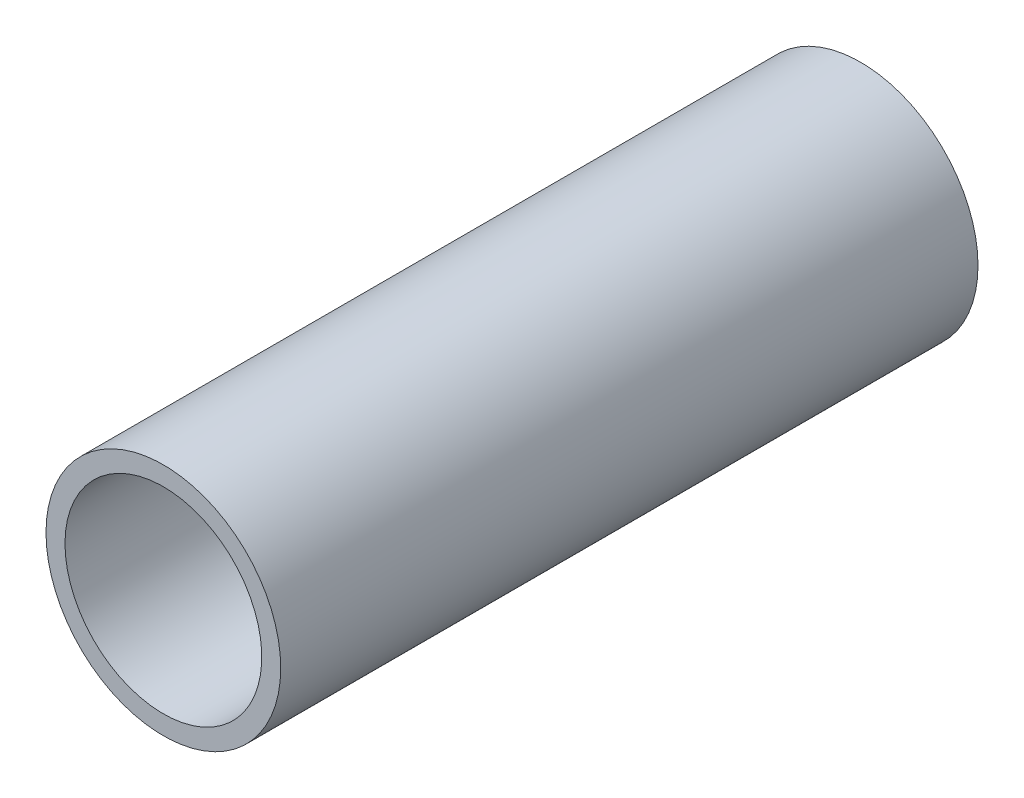
ISO-10303-21;
HEADER;
FILE_DESCRIPTION(('STEP AP214'),'2;1');
FILE_NAME('part.step','',(''),(''),'','','');
FILE_SCHEMA(('AUTOMOTIVE_DESIGN { 1 0 10303 214 1 1 1 1 }'));
ENDSEC;
DATA;
#1=APPLICATION_CONTEXT('core data for automotive mechanical design processes');
#2=APPLICATION_PROTOCOL_DEFINITION('international standard','automotive_design',2000,#1);
#3=PRODUCT_CONTEXT('',#1,'mechanical');
#4=PRODUCT('Part','Part','',(#3));
#5=PRODUCT_RELATED_PRODUCT_CATEGORY('part','',(#4));
#6=PRODUCT_DEFINITION_FORMATION('','',#4);
#7=PRODUCT_DEFINITION_CONTEXT('part definition',#1,'design');
#8=PRODUCT_DEFINITION('design','',#6,#7);
#9=PRODUCT_DEFINITION_SHAPE('','',#8);
#10=(LENGTH_UNIT() NAMED_UNIT(*) SI_UNIT(.MILLI.,.METRE.));
#11=(NAMED_UNIT(*) PLANE_ANGLE_UNIT() SI_UNIT($,.RADIAN.));
#12=(NAMED_UNIT(*) SI_UNIT($,.STERADIAN.) SOLID_ANGLE_UNIT());
#13=UNCERTAINTY_MEASURE_WITH_UNIT(LENGTH_MEASURE(1.E-05),#10,'distance_accuracy_value','');
#14=(GEOMETRIC_REPRESENTATION_CONTEXT(3) GLOBAL_UNCERTAINTY_ASSIGNED_CONTEXT((#13)) GLOBAL_UNIT_ASSIGNED_CONTEXT((#10,
#11,#12)) REPRESENTATION_CONTEXT('',''));
#15=CARTESIAN_POINT('',(0.,0.,0.));
#16=DIRECTION('',(0.,0.,1.));
#17=DIRECTION('',(1.,0.,0.));
#18=AXIS2_PLACEMENT_3D('',#15,#16,#17);
#19=CARTESIAN_POINT('',(0.,0.,180.));
#20=DIRECTION('',(0.,0.,1.));
#21=DIRECTION('',(1.,0.,0.));
#22=AXIS2_PLACEMENT_3D('',#19,#20,#21);
#23=PLANE('',#22);
#24=CARTESIAN_POINT('',(0.,0.,180.));
#25=DIRECTION('',(0.,0.,1.));
#26=DIRECTION('',(1.,0.,0.));
#27=AXIS2_PLACEMENT_3D('',#24,#25,#26);
#28=CIRCLE('',#27,30.3);
#29=CARTESIAN_POINT('',(-30.3,0.,180.));
#30=VERTEX_POINT('',#29);
#31=EDGE_CURVE('E10',#30,#30,#28,.T.);
#32=ORIENTED_EDGE('',*,*,#31,.T.);
#33=EDGE_LOOP('',(#32));
#34=FACE_BOUND('',#33,.T.);
#35=CARTESIAN_POINT('',(0.,0.,180.));
#36=DIRECTION('',(0.,0.,1.));
#37=DIRECTION('',(1.,0.,0.));
#38=AXIS2_PLACEMENT_3D('',#35,#36,#37);
#39=CIRCLE('',#38,25.4);
#40=CARTESIAN_POINT('',(-25.4,0.,180.));
#41=VERTEX_POINT('',#40);
#42=EDGE_CURVE('E54',#41,#41,#39,.T.);
#43=ORIENTED_EDGE('',*,*,#42,.F.);
#44=EDGE_LOOP('',(#43));
#45=FACE_BOUND('',#44,.T.);
#46=ADVANCED_FACE('F41',(#34,#45),#23,.T.);
#47=CARTESIAN_POINT('',(0.,0.,0.));
#48=DIRECTION('',(0.,0.,1.));
#49=DIRECTION('',(1.,0.,0.));
#50=AXIS2_PLACEMENT_3D('',#47,#48,#49);
#51=PLANE('',#50);
#52=CARTESIAN_POINT('',(0.,0.,0.));
#53=DIRECTION('',(0.,0.,1.));
#54=DIRECTION('',(1.,0.,0.));
#55=AXIS2_PLACEMENT_3D('',#52,#53,#54);
#56=CIRCLE('',#55,30.3);
#57=CARTESIAN_POINT('',(-30.3,0.,0.));
#58=VERTEX_POINT('',#57);
#59=EDGE_CURVE('E45',#58,#58,#56,.T.);
#60=ORIENTED_EDGE('',*,*,#59,.F.);
#61=EDGE_LOOP('',(#60));
#62=FACE_BOUND('',#61,.T.);
#63=CARTESIAN_POINT('',(0.,0.,0.));
#64=DIRECTION('',(0.,0.,1.));
#65=DIRECTION('',(1.,0.,0.));
#66=AXIS2_PLACEMENT_3D('',#63,#64,#65);
#67=CIRCLE('',#66,25.4);
#68=CARTESIAN_POINT('',(-25.4,0.,0.));
#69=VERTEX_POINT('',#68);
#70=EDGE_CURVE('E56',#69,#69,#67,.T.);
#71=ORIENTED_EDGE('',*,*,#70,.T.);
#72=EDGE_LOOP('',(#71));
#73=FACE_BOUND('',#72,.T.);
#74=ADVANCED_FACE('F68',(#62,#73),#51,.F.);
#75=CARTESIAN_POINT('',(0.,0.,180.));
#76=DIRECTION('',(0.,0.,-1.));
#77=DIRECTION('',(-1.,0.,0.));
#78=AXIS2_PLACEMENT_3D('',#75,#76,#77);
#79=CYLINDRICAL_SURFACE('',#78,30.3);
#80=CARTESIAN_POINT('',(-30.3,0.,180.));
#81=CARTESIAN_POINT('',(-30.3,0.,178.125));
#82=CARTESIAN_POINT('',(-30.3,0.,176.25));
#83=CARTESIAN_POINT('',(-30.3,0.,172.5));
#84=CARTESIAN_POINT('',(-30.3,0.,170.625));
#85=CARTESIAN_POINT('',(-30.3,0.,166.875));
#86=CARTESIAN_POINT('',(-30.3,0.,165.));
#87=CARTESIAN_POINT('',(-30.3,0.,161.25));
#88=CARTESIAN_POINT('',(-30.3,0.,159.375));
#89=CARTESIAN_POINT('',(-30.3,0.,155.625));
#90=CARTESIAN_POINT('',(-30.3,0.,153.75));
#91=CARTESIAN_POINT('',(-30.3,0.,150.));
#92=CARTESIAN_POINT('',(-30.3,0.,148.125));
#93=CARTESIAN_POINT('',(-30.3,0.,144.375));
#94=CARTESIAN_POINT('',(-30.3,0.,142.5));
#95=CARTESIAN_POINT('',(-30.3,0.,138.75));
#96=CARTESIAN_POINT('',(-30.3,0.,136.875));
#97=CARTESIAN_POINT('',(-30.3,0.,133.125));
#98=CARTESIAN_POINT('',(-30.3,0.,131.25));
#99=CARTESIAN_POINT('',(-30.3,0.,127.5));
#100=CARTESIAN_POINT('',(-30.3,0.,125.625));
#101=CARTESIAN_POINT('',(-30.3,0.,121.875));
#102=CARTESIAN_POINT('',(-30.3,0.,120.));
#103=CARTESIAN_POINT('',(-30.3,0.,116.25));
#104=CARTESIAN_POINT('',(-30.3,0.,114.375));
#105=CARTESIAN_POINT('',(-30.3,0.,110.625));
#106=CARTESIAN_POINT('',(-30.3,0.,108.75));
#107=CARTESIAN_POINT('',(-30.3,0.,105.));
#108=CARTESIAN_POINT('',(-30.3,0.,103.125));
#109=CARTESIAN_POINT('',(-30.3,0.,99.375));
#110=CARTESIAN_POINT('',(-30.3,0.,97.5));
#111=CARTESIAN_POINT('',(-30.3,0.,93.75));
#112=CARTESIAN_POINT('',(-30.3,0.,91.875));
#113=CARTESIAN_POINT('',(-30.3,0.,88.125));
#114=CARTESIAN_POINT('',(-30.3,0.,86.25));
#115=CARTESIAN_POINT('',(-30.3,0.,82.5));
#116=CARTESIAN_POINT('',(-30.3,0.,80.625));
#117=CARTESIAN_POINT('',(-30.3,0.,76.875));
#118=CARTESIAN_POINT('',(-30.3,0.,75.));
#119=CARTESIAN_POINT('',(-30.3,0.,71.25));
#120=CARTESIAN_POINT('',(-30.3,0.,69.375));
#121=CARTESIAN_POINT('',(-30.3,0.,65.625));
#122=CARTESIAN_POINT('',(-30.3,0.,63.75));
#123=CARTESIAN_POINT('',(-30.3,0.,60.));
#124=CARTESIAN_POINT('',(-30.3,0.,58.125));
#125=CARTESIAN_POINT('',(-30.3,0.,54.375));
#126=CARTESIAN_POINT('',(-30.3,0.,52.5));
#127=CARTESIAN_POINT('',(-30.3,0.,48.75));
#128=CARTESIAN_POINT('',(-30.3,0.,46.875));
#129=CARTESIAN_POINT('',(-30.3,0.,43.125));
#130=CARTESIAN_POINT('',(-30.3,0.,41.25));
#131=CARTESIAN_POINT('',(-30.3,0.,37.5));
#132=CARTESIAN_POINT('',(-30.3,0.,35.625));
#133=CARTESIAN_POINT('',(-30.3,0.,31.875));
#134=CARTESIAN_POINT('',(-30.3,0.,30.));
#135=CARTESIAN_POINT('',(-30.3,0.,26.25));
#136=CARTESIAN_POINT('',(-30.3,0.,24.375));
#137=CARTESIAN_POINT('',(-30.3,0.,20.625));
#138=CARTESIAN_POINT('',(-30.3,0.,18.75));
#139=CARTESIAN_POINT('',(-30.3,0.,15.));
#140=CARTESIAN_POINT('',(-30.3,0.,13.125));
#141=CARTESIAN_POINT('',(-30.3,0.,9.37499999999998));
#142=CARTESIAN_POINT('',(-30.3,0.,7.49999999999997));
#143=CARTESIAN_POINT('',(-30.3,0.,3.74999999999997));
#144=CARTESIAN_POINT('',(-30.3,0.,1.87499999999997));
#145=CARTESIAN_POINT('',(-30.3,0.,0.));
#146=B_SPLINE_CURVE_WITH_KNOTS('',3,(#80,#81,#82,#83,#84,#85,#86,#87,#88,#89,#90,#91,#92,#93,
#94,#95,#96,#97,#98,#99,#100,#101,#102,#103,#104,#105,#106,#107,#108,#109,#110,#111,#112,#113,
#114,#115,#116,#117,#118,#119,#120,#121,#122,#123,#124,#125,#126,#127,#128,#129,#130,#131,#132,
#133,#134,#135,#136,#137,#138,#139,#140,#141,#142,#143,#144,#145),.UNSPECIFIED.,.F.,.F.,(4,2,2,
2,2,2,2,2,2,2,2,2,2,2,2,2,2,2,2,2,2,2,2,2,2,2,2,2,2,2,2,2,4),(0.,5.62500000000002,11.25,16.875,
22.5,28.125,33.75,39.375,45.,50.625,56.25,61.875,67.5,73.125,78.75,84.375,90.,95.625,101.25,
106.875,112.5,118.125,123.75,129.375,135.,140.625,146.25,151.875,157.5,163.125,168.75,174.375,
180.),.UNSPECIFIED.);
#147=EDGE_CURVE('BSEAM43',#30,#58,#146,.T.);
#148=ORIENTED_EDGE('',*,*,#31,.F.);
#149=ORIENTED_EDGE('',*,*,#59,.T.);
#150=ORIENTED_EDGE('',*,*,#147,.T.);
#151=ORIENTED_EDGE('',*,*,#147,.F.);
#152=EDGE_LOOP('',(#148,#150,#149,#151));
#153=FACE_BOUND('',#152,.T.);
#154=ADVANCED_FACE('F43',(#153),#79,.T.);
#155=CARTESIAN_POINT('',(0.,0.,180.));
#156=DIRECTION('',(0.,0.,-1.));
#157=DIRECTION('',(-1.,0.,0.));
#158=AXIS2_PLACEMENT_3D('',#155,#156,#157);
#159=CYLINDRICAL_SURFACE('',#158,25.4);
#160=CARTESIAN_POINT('',(-25.4,0.,180.));
#161=CARTESIAN_POINT('',(-25.4,0.,178.125));
#162=CARTESIAN_POINT('',(-25.4,0.,176.25));
#163=CARTESIAN_POINT('',(-25.4,0.,172.5));
#164=CARTESIAN_POINT('',(-25.4,0.,170.625));
#165=CARTESIAN_POINT('',(-25.4,0.,166.875));
#166=CARTESIAN_POINT('',(-25.4,0.,165.));
#167=CARTESIAN_POINT('',(-25.4,0.,161.25));
#168=CARTESIAN_POINT('',(-25.4,0.,159.375));
#169=CARTESIAN_POINT('',(-25.4,0.,155.625));
#170=CARTESIAN_POINT('',(-25.4,0.,153.75));
#171=CARTESIAN_POINT('',(-25.4,0.,150.));
#172=CARTESIAN_POINT('',(-25.4,0.,148.125));
#173=CARTESIAN_POINT('',(-25.4,0.,144.375));
#174=CARTESIAN_POINT('',(-25.4,0.,142.5));
#175=CARTESIAN_POINT('',(-25.4,0.,138.75));
#176=CARTESIAN_POINT('',(-25.4,0.,136.875));
#177=CARTESIAN_POINT('',(-25.4,0.,133.125));
#178=CARTESIAN_POINT('',(-25.4,0.,131.25));
#179=CARTESIAN_POINT('',(-25.4,0.,127.5));
#180=CARTESIAN_POINT('',(-25.4,0.,125.625));
#181=CARTESIAN_POINT('',(-25.4,0.,121.875));
#182=CARTESIAN_POINT('',(-25.4,0.,120.));
#183=CARTESIAN_POINT('',(-25.4,0.,116.25));
#184=CARTESIAN_POINT('',(-25.4,0.,114.375));
#185=CARTESIAN_POINT('',(-25.4,0.,110.625));
#186=CARTESIAN_POINT('',(-25.4,0.,108.75));
#187=CARTESIAN_POINT('',(-25.4,0.,105.));
#188=CARTESIAN_POINT('',(-25.4,0.,103.125));
#189=CARTESIAN_POINT('',(-25.4,0.,99.375));
#190=CARTESIAN_POINT('',(-25.4,0.,97.5));
#191=CARTESIAN_POINT('',(-25.4,0.,93.75));
#192=CARTESIAN_POINT('',(-25.4,0.,91.875));
#193=CARTESIAN_POINT('',(-25.4,0.,88.125));
#194=CARTESIAN_POINT('',(-25.4,0.,86.25));
#195=CARTESIAN_POINT('',(-25.4,0.,82.5));
#196=CARTESIAN_POINT('',(-25.4,0.,80.625));
#197=CARTESIAN_POINT('',(-25.4,0.,76.875));
#198=CARTESIAN_POINT('',(-25.4,0.,75.));
#199=CARTESIAN_POINT('',(-25.4,0.,71.25));
#200=CARTESIAN_POINT('',(-25.4,0.,69.375));
#201=CARTESIAN_POINT('',(-25.4,0.,65.625));
#202=CARTESIAN_POINT('',(-25.4,0.,63.75));
#203=CARTESIAN_POINT('',(-25.4,0.,60.));
#204=CARTESIAN_POINT('',(-25.4,0.,58.125));
#205=CARTESIAN_POINT('',(-25.4,0.,54.375));
#206=CARTESIAN_POINT('',(-25.4,0.,52.5));
#207=CARTESIAN_POINT('',(-25.4,0.,48.75));
#208=CARTESIAN_POINT('',(-25.4,0.,46.875));
#209=CARTESIAN_POINT('',(-25.4,0.,43.125));
#210=CARTESIAN_POINT('',(-25.4,0.,41.25));
#211=CARTESIAN_POINT('',(-25.4,0.,37.5));
#212=CARTESIAN_POINT('',(-25.4,0.,35.625));
#213=CARTESIAN_POINT('',(-25.4,0.,31.875));
#214=CARTESIAN_POINT('',(-25.4,0.,30.));
#215=CARTESIAN_POINT('',(-25.4,0.,26.25));
#216=CARTESIAN_POINT('',(-25.4,0.,24.375));
#217=CARTESIAN_POINT('',(-25.4,0.,20.625));
#218=CARTESIAN_POINT('',(-25.4,0.,18.75));
#219=CARTESIAN_POINT('',(-25.4,0.,15.));
#220=CARTESIAN_POINT('',(-25.4,0.,13.125));
#221=CARTESIAN_POINT('',(-25.4,0.,9.37499999999998));
#222=CARTESIAN_POINT('',(-25.4,0.,7.49999999999997));
#223=CARTESIAN_POINT('',(-25.4,0.,3.74999999999997));
#224=CARTESIAN_POINT('',(-25.4,0.,1.87499999999997));
#225=CARTESIAN_POINT('',(-25.4,0.,0.));
#226=B_SPLINE_CURVE_WITH_KNOTS('',3,(#160,#161,#162,#163,#164,#165,#166,#167,#168,#169,#170,
#171,#172,#173,#174,#175,#176,#177,#178,#179,#180,#181,#182,#183,#184,#185,#186,#187,#188,#189,
#190,#191,#192,#193,#194,#195,#196,#197,#198,#199,#200,#201,#202,#203,#204,#205,#206,#207,#208,
#209,#210,#211,#212,#213,#214,#215,#216,#217,#218,#219,#220,#221,#222,#223,#224,#225),
.UNSPECIFIED.,.F.,.F.,(4,2,2,2,2,2,2,2,2,2,2,2,2,2,2,2,2,2,2,2,2,2,2,2,2,2,2,2,2,2,2,2,4),(0.,
5.62500000000002,11.25,16.875,22.5,28.125,33.75,39.375,45.,50.625,56.25,61.875,67.5,73.125,
78.75,84.375,90.,95.625,101.25,106.875,112.5,118.125,123.75,129.375,135.,140.625,146.25,151.875,
157.5,163.125,168.75,174.375,180.),.UNSPECIFIED.);
#227=EDGE_CURVE('BSEAM64',#41,#69,#226,.T.);
#228=ORIENTED_EDGE('',*,*,#42,.T.);
#229=ORIENTED_EDGE('',*,*,#70,.F.);
#230=ORIENTED_EDGE('',*,*,#227,.T.);
#231=ORIENTED_EDGE('',*,*,#227,.F.);
#232=EDGE_LOOP('',(#228,#230,#229,#231));
#233=FACE_BOUND('',#232,.T.);
#234=ADVANCED_FACE('F64',(#233),#159,.F.);
#235=CLOSED_SHELL('',(#46,#74,#154,#234));
#236=MANIFOLD_SOLID_BREP('B2',#235);
#237=ADVANCED_BREP_SHAPE_REPRESENTATION('',(#18,#236),#14);
#238=SHAPE_DEFINITION_REPRESENTATION(#9,#237);
ENDSEC;
END-ISO-10303-21;
